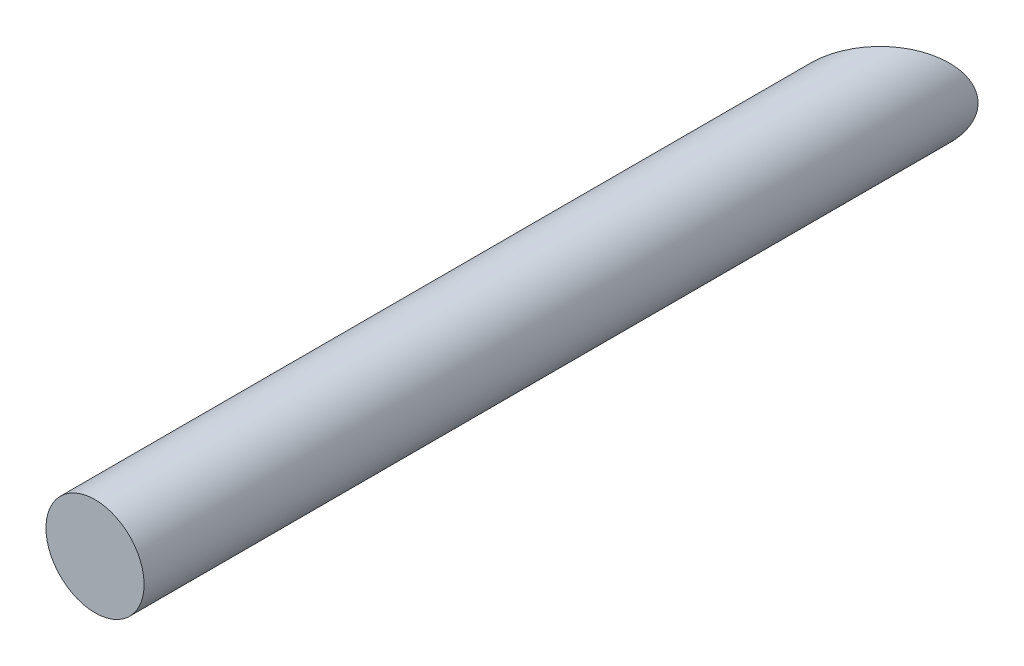
ISO-10303-21;
HEADER;
FILE_DESCRIPTION(('STEP AP214'),'2;1');
FILE_NAME('part.step','',(''),(''),'','','');
FILE_SCHEMA(('AUTOMOTIVE_DESIGN { 1 0 10303 214 1 1 1 1 }'));
ENDSEC;
DATA;
#1=APPLICATION_CONTEXT('core data for automotive mechanical design processes');
#2=APPLICATION_PROTOCOL_DEFINITION('international standard','automotive_design',2000,#1);
#3=PRODUCT_CONTEXT('',#1,'mechanical');
#4=PRODUCT('Part','Part','',(#3));
#5=PRODUCT_RELATED_PRODUCT_CATEGORY('part','',(#4));
#6=PRODUCT_DEFINITION_FORMATION('','',#4);
#7=PRODUCT_DEFINITION_CONTEXT('part definition',#1,'design');
#8=PRODUCT_DEFINITION('design','',#6,#7);
#9=PRODUCT_DEFINITION_SHAPE('','',#8);
#10=(LENGTH_UNIT() NAMED_UNIT(*) SI_UNIT(.MILLI.,.METRE.));
#11=(NAMED_UNIT(*) PLANE_ANGLE_UNIT() SI_UNIT($,.RADIAN.));
#12=(NAMED_UNIT(*) SI_UNIT($,.STERADIAN.) SOLID_ANGLE_UNIT());
#13=UNCERTAINTY_MEASURE_WITH_UNIT(LENGTH_MEASURE(1.E-05),#10,'distance_accuracy_value','');
#14=(GEOMETRIC_REPRESENTATION_CONTEXT(3) GLOBAL_UNCERTAINTY_ASSIGNED_CONTEXT((#13)) GLOBAL_UNIT_ASSIGNED_CONTEXT((#10,
#11,#12)) REPRESENTATION_CONTEXT('',''));
#15=CARTESIAN_POINT('',(0.,0.,0.));
#16=DIRECTION('',(0.,0.,1.));
#17=DIRECTION('',(1.,0.,0.));
#18=AXIS2_PLACEMENT_3D('',#15,#16,#17);
#19=CARTESIAN_POINT('',(0.,0.,0.));
#20=DIRECTION('',(0.707106781186548,0.,0.707106781186547));
#21=DIRECTION('',(0.707106781186547,0.,-0.707106781186548));
#22=AXIS2_PLACEMENT_3D('',#19,#20,#21);
#23=PLANE('',#22);
#24=CARTESIAN_POINT('',(0.,0.,0.));
#25=DIRECTION('',(0.707106781186548,0.,0.707106781186548));
#26=DIRECTION('',(-0.707106781186548,0.,0.707106781186548));
#27=AXIS2_PLACEMENT_3D('',#24,#25,#26);
#28=ELLIPSE('',#27,26.9407683632075,19.05);
#29=CARTESIAN_POINT('',(-19.05,0.,19.05));
#30=VERTEX_POINT('',#29);
#31=EDGE_CURVE('E9',#30,#30,#28,.T.);
#32=ORIENTED_EDGE('',*,*,#31,.F.);
#33=EDGE_LOOP('',(#32));
#34=FACE_BOUND('',#33,.T.);
#35=ADVANCED_FACE('F14',(#34),#23,.F.);
#36=CARTESIAN_POINT('',(0.,0.,0.));
#37=DIRECTION('',(0.,0.,1.));
#38=DIRECTION('',(1.,0.,0.));
#39=AXIS2_PLACEMENT_3D('',#36,#37,#38);
#40=CYLINDRICAL_SURFACE('',#39,19.05);
#41=ORIENTED_EDGE('',*,*,#31,.T.);
#42=EDGE_LOOP('',(#41));
#43=FACE_BOUND('',#42,.T.);
#44=CARTESIAN_POINT('',(0.,0.,304.8));
#45=DIRECTION('',(0.,0.,-1.));
#46=DIRECTION('',(0.,-1.,0.));
#47=AXIS2_PLACEMENT_3D('',#44,#45,#46);
#48=CIRCLE('',#47,19.05);
#49=CARTESIAN_POINT('',(0.,-19.05,304.8));
#50=VERTEX_POINT('',#49);
#51=EDGE_CURVE('E18',#50,#50,#48,.T.);
#52=ORIENTED_EDGE('',*,*,#51,.T.);
#53=EDGE_LOOP('',(#52));
#54=FACE_BOUND('',#53,.T.);
#55=ADVANCED_FACE('F16',(#43,#54),#40,.T.);
#56=CARTESIAN_POINT('',(0.,0.,304.8));
#57=DIRECTION('',(0.,0.,1.));
#58=DIRECTION('',(1.,0.,0.));
#59=AXIS2_PLACEMENT_3D('',#56,#57,#58);
#60=PLANE('',#59);
#61=ORIENTED_EDGE('',*,*,#51,.F.);
#62=EDGE_LOOP('',(#61));
#63=FACE_BOUND('',#62,.T.);
#64=ADVANCED_FACE('F28',(#63),#60,.T.);
#65=CLOSED_SHELL('',(#35,#55,#64));
#66=MANIFOLD_SOLID_BREP('B1',#65);
#67=ADVANCED_BREP_SHAPE_REPRESENTATION('',(#18,#66),#14);
#68=SHAPE_DEFINITION_REPRESENTATION(#9,#67);
ENDSEC;
END-ISO-10303-21;
